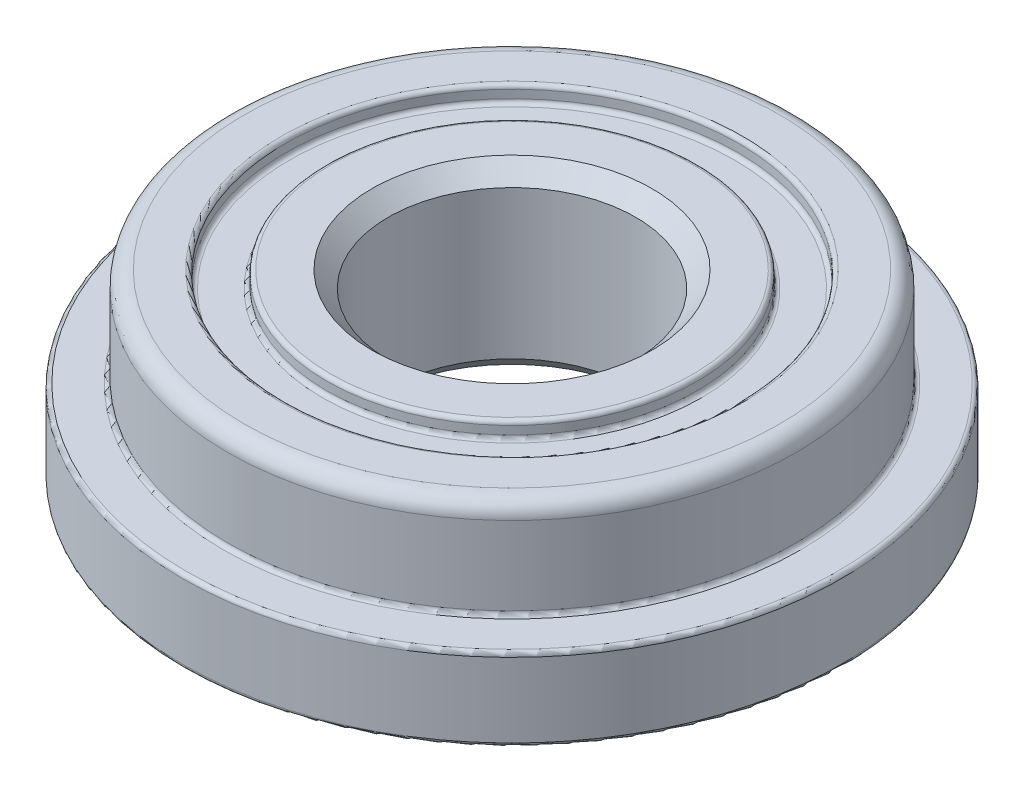
ISO-10303-21;
HEADER;
FILE_DESCRIPTION(('STEP AP214'),'2;1');
FILE_NAME('part.step','',(''),(''),'','','');
FILE_SCHEMA(('AUTOMOTIVE_DESIGN { 1 0 10303 214 1 1 1 1 }'));
ENDSEC;
DATA;
#1=APPLICATION_CONTEXT('core data for automotive mechanical design processes');
#2=APPLICATION_PROTOCOL_DEFINITION('international standard','automotive_design',2000,#1);
#3=PRODUCT_CONTEXT('',#1,'mechanical');
#4=PRODUCT('Part','Part','',(#3));
#5=PRODUCT_RELATED_PRODUCT_CATEGORY('part','',(#4));
#6=PRODUCT_DEFINITION_FORMATION('','',#4);
#7=PRODUCT_DEFINITION_CONTEXT('part definition',#1,'design');
#8=PRODUCT_DEFINITION('design','',#6,#7);
#9=PRODUCT_DEFINITION_SHAPE('','',#8);
#10=(LENGTH_UNIT() NAMED_UNIT(*) SI_UNIT(.MILLI.,.METRE.));
#11=(NAMED_UNIT(*) PLANE_ANGLE_UNIT() SI_UNIT($,.RADIAN.));
#12=(NAMED_UNIT(*) SI_UNIT($,.STERADIAN.) SOLID_ANGLE_UNIT());
#13=UNCERTAINTY_MEASURE_WITH_UNIT(LENGTH_MEASURE(1.E-05),#10,'distance_accuracy_value','');
#14=(GEOMETRIC_REPRESENTATION_CONTEXT(3) GLOBAL_UNCERTAINTY_ASSIGNED_CONTEXT((#13)) GLOBAL_UNIT_ASSIGNED_CONTEXT((#10,
#11,#12)) REPRESENTATION_CONTEXT('',''));
#15=CARTESIAN_POINT('',(0.,0.,0.));
#16=DIRECTION('',(0.,0.,1.));
#17=DIRECTION('',(1.,0.,0.));
#18=AXIS2_PLACEMENT_3D('',#15,#16,#17);
#19=CARTESIAN_POINT('',(0.,2.2,0.));
#20=DIRECTION('',(0.,1.,0.));
#21=DIRECTION('',(0.,0.,1.));
#22=AXIS2_PLACEMENT_3D('',#19,#20,#21);
#23=PLANE('',#22);
#24=CARTESIAN_POINT('',(0.,2.2,0.));
#25=DIRECTION('',(0.,1.,0.));
#26=DIRECTION('',(0.,0.,1.));
#27=AXIS2_PLACEMENT_3D('',#24,#25,#26);
#28=CIRCLE('',#27,2.2);
#29=CARTESIAN_POINT('',(0.,2.2,2.2));
#30=VERTEX_POINT('',#29);
#31=EDGE_CURVE('E84',#30,#30,#28,.T.);
#32=ORIENTED_EDGE('',*,*,#31,.T.);
#33=EDGE_LOOP('',(#32));
#34=FACE_BOUND('',#33,.T.);
#35=CARTESIAN_POINT('',(0.,2.2,0.));
#36=DIRECTION('',(0.,1.,0.));
#37=DIRECTION('',(0.,0.,1.));
#38=AXIS2_PLACEMENT_3D('',#35,#36,#37);
#39=CIRCLE('',#38,1.7);
#40=CARTESIAN_POINT('',(0.,2.2,1.7));
#41=VERTEX_POINT('',#40);
#42=EDGE_CURVE('E90',#41,#41,#39,.F.);
#43=ORIENTED_EDGE('',*,*,#42,.T.);
#44=EDGE_LOOP('',(#43));
#45=FACE_BOUND('',#44,.T.);
#46=ADVANCED_FACE('F37',(#34,#45),#23,.T.);
#47=CARTESIAN_POINT('',(0.,1.,0.));
#48=DIRECTION('',(0.,1.,0.));
#49=DIRECTION('',(0.,0.,1.));
#50=AXIS2_PLACEMENT_3D('',#47,#48,#49);
#51=PLANE('',#50);
#52=CARTESIAN_POINT('',(0.,1.,0.));
#53=DIRECTION('',(0.,1.,0.));
#54=DIRECTION('',(0.,0.,1.));
#55=AXIS2_PLACEMENT_3D('',#52,#53,#54);
#56=CIRCLE('',#55,3.95);
#57=CARTESIAN_POINT('',(0.,1.,3.95));
#58=VERTEX_POINT('',#57);
#59=EDGE_CURVE('E57',#58,#58,#56,.T.);
#60=ORIENTED_EDGE('',*,*,#59,.T.);
#61=EDGE_LOOP('',(#60));
#62=FACE_BOUND('',#61,.T.);
#63=CARTESIAN_POINT('',(0.,1.,0.));
#64=DIRECTION('',(0.,1.,0.));
#65=DIRECTION('',(0.,0.,1.));
#66=AXIS2_PLACEMENT_3D('',#63,#64,#65);
#67=CIRCLE('',#66,3.5);
#68=CARTESIAN_POINT('',(0.,1.,3.5));
#69=VERTEX_POINT('',#68);
#70=EDGE_CURVE('E60',#69,#69,#67,.F.);
#71=ORIENTED_EDGE('',*,*,#70,.T.);
#72=EDGE_LOOP('',(#71));
#73=FACE_BOUND('',#72,.T.);
#74=ADVANCED_FACE('F127',(#62,#73),#51,.T.);
#75=CARTESIAN_POINT('',(0.,1.,0.));
#76=DIRECTION('',(0.,-1.,0.));
#77=DIRECTION('',(0.,0.,-1.));
#78=AXIS2_PLACEMENT_3D('',#75,#76,#77);
#79=CYLINDRICAL_SURFACE('',#78,4.);
#80=CARTESIAN_POINT('',(0.,0.95,0.));
#81=DIRECTION('',(0.,1.,0.));
#82=DIRECTION('',(0.,0.,1.));
#83=AXIS2_PLACEMENT_3D('',#80,#81,#82);
#84=CIRCLE('',#83,4.);
#85=CARTESIAN_POINT('',(0.,0.95,4.));
#86=VERTEX_POINT('',#85);
#87=EDGE_CURVE('E48',#86,#86,#84,.F.);
#88=ORIENTED_EDGE('',*,*,#87,.T.);
#89=EDGE_LOOP('',(#88));
#90=FACE_BOUND('',#89,.T.);
#91=CARTESIAN_POINT('',(0.,0.05,0.));
#92=DIRECTION('',(0.,1.,0.));
#93=DIRECTION('',(0.,0.,1.));
#94=AXIS2_PLACEMENT_3D('',#91,#92,#93);
#95=CIRCLE('',#94,4.);
#96=CARTESIAN_POINT('',(0.,0.05,4.));
#97=VERTEX_POINT('',#96);
#98=EDGE_CURVE('E52',#97,#97,#95,.T.);
#99=ORIENTED_EDGE('',*,*,#98,.T.);
#100=EDGE_LOOP('',(#99));
#101=FACE_BOUND('',#100,.T.);
#102=ADVANCED_FACE('F132',(#90,#101),#79,.T.);
#103=CARTESIAN_POINT('',(0.,0.,0.));
#104=DIRECTION('',(0.,1.,0.));
#105=DIRECTION('',(0.,0.,1.));
#106=AXIS2_PLACEMENT_3D('',#103,#104,#105);
#107=PLANE('',#106);
#108=CARTESIAN_POINT('',(0.,0.,0.));
#109=DIRECTION('',(0.,1.,0.));
#110=DIRECTION('',(0.,0.,1.));
#111=AXIS2_PLACEMENT_3D('',#108,#109,#110);
#112=CIRCLE('',#111,3.95);
#113=CARTESIAN_POINT('',(0.,0.,3.95));
#114=VERTEX_POINT('',#113);
#115=EDGE_CURVE('E10',#114,#114,#112,.F.);
#116=ORIENTED_EDGE('',*,*,#115,.T.);
#117=EDGE_LOOP('',(#116));
#118=FACE_BOUND('',#117,.T.);
#119=CARTESIAN_POINT('',(0.,0.,0.));
#120=DIRECTION('',(0.,1.,0.));
#121=DIRECTION('',(0.,0.,1.));
#122=AXIS2_PLACEMENT_3D('',#119,#120,#121);
#123=CIRCLE('',#122,1.7);
#124=CARTESIAN_POINT('',(0.,0.,1.7));
#125=VERTEX_POINT('',#124);
#126=EDGE_CURVE('E87',#125,#125,#123,.T.);
#127=ORIENTED_EDGE('',*,*,#126,.T.);
#128=EDGE_LOOP('',(#127));
#129=FACE_BOUND('',#128,.T.);
#130=ADVANCED_FACE('F139',(#118,#129),#107,.F.);
#131=CARTESIAN_POINT('',(0.,2.2,0.));
#132=DIRECTION('',(0.,-1.,0.));
#133=DIRECTION('',(0.,0.,-1.));
#134=AXIS2_PLACEMENT_3D('',#131,#132,#133);
#135=CYLINDRICAL_SURFACE('',#134,3.45);
#136=CARTESIAN_POINT('',(0.,1.05,0.));
#137=DIRECTION('',(0.,1.,0.));
#138=DIRECTION('',(0.,0.,1.));
#139=AXIS2_PLACEMENT_3D('',#136,#137,#138);
#140=CIRCLE('',#139,3.45);
#141=CARTESIAN_POINT('',(0.,1.05,3.45));
#142=VERTEX_POINT('',#141);
#143=EDGE_CURVE('E44',#142,#142,#140,.T.);
#144=ORIENTED_EDGE('',*,*,#143,.T.);
#145=EDGE_LOOP('',(#144));
#146=FACE_BOUND('',#145,.T.);
#147=CARTESIAN_POINT('',(0.,2.,0.));
#148=DIRECTION('',(0.,1.,0.));
#149=DIRECTION('',(0.,0.,1.));
#150=AXIS2_PLACEMENT_3D('',#147,#148,#149);
#151=CIRCLE('',#150,3.45);
#152=CARTESIAN_POINT('',(0.,2.,3.45));
#153=VERTEX_POINT('',#152);
#154=EDGE_CURVE('E99',#153,#153,#151,.F.);
#155=ORIENTED_EDGE('',*,*,#154,.T.);
#156=EDGE_LOOP('',(#155));
#157=FACE_BOUND('',#156,.T.);
#158=ADVANCED_FACE('F120',(#146,#157),#135,.T.);
#159=CARTESIAN_POINT('',(0.,2.2,0.));
#160=DIRECTION('',(0.,1.,0.));
#161=DIRECTION('',(0.,0.,1.));
#162=AXIS2_PLACEMENT_3D('',#159,#160,#161);
#163=CIRCLE('',#162,2.8);
#164=CARTESIAN_POINT('',(0.,2.2,2.8));
#165=VERTEX_POINT('',#164);
#166=EDGE_CURVE('E63',#165,#165,#163,.F.);
#167=ORIENTED_EDGE('',*,*,#166,.T.);
#168=EDGE_LOOP('',(#167));
#169=FACE_BOUND('',#168,.T.);
#170=CARTESIAN_POINT('',(0.,2.2,0.));
#171=DIRECTION('',(0.,1.,0.));
#172=DIRECTION('',(0.,0.,1.));
#173=AXIS2_PLACEMENT_3D('',#170,#171,#172);
#174=CIRCLE('',#173,3.25);
#175=CARTESIAN_POINT('',(0.,2.2,3.25));
#176=VERTEX_POINT('',#175);
#177=EDGE_CURVE('E102',#176,#176,#174,.T.);
#178=ORIENTED_EDGE('',*,*,#177,.T.);
#179=EDGE_LOOP('',(#178));
#180=FACE_BOUND('',#179,.T.);
#181=ADVANCED_FACE('F106',(#169,#180),#23,.T.);
#182=CARTESIAN_POINT('',(0.,2.,0.));
#183=DIRECTION('',(0.,1.,0.));
#184=DIRECTION('',(0.,0.,1.));
#185=AXIS2_PLACEMENT_3D('',#182,#183,#184);
#186=TOROIDAL_SURFACE('',#185,3.25,0.2);
#187=ORIENTED_EDGE('',*,*,#154,.F.);
#188=EDGE_LOOP('',(#187));
#189=FACE_BOUND('',#188,.T.);
#190=ORIENTED_EDGE('',*,*,#177,.F.);
#191=EDGE_LOOP('',(#190));
#192=FACE_BOUND('',#191,.T.);
#193=ADVANCED_FACE('F108',(#189,#192),#186,.T.);
#194=CARTESIAN_POINT('',(0.,0.,0.));
#195=DIRECTION('',(0.,1.,0.));
#196=DIRECTION('',(0.,0.,1.));
#197=AXIS2_PLACEMENT_3D('',#194,#195,#196);
#198=CYLINDRICAL_SURFACE('',#197,1.5);
#199=CARTESIAN_POINT('',(0.,2.,0.));
#200=DIRECTION('',(0.,1.,0.));
#201=DIRECTION('',(0.,0.,1.));
#202=AXIS2_PLACEMENT_3D('',#199,#200,#201);
#203=CIRCLE('',#202,1.5);
#204=CARTESIAN_POINT('',(0.,2.,1.5));
#205=VERTEX_POINT('',#204);
#206=EDGE_CURVE('E93',#205,#205,#203,.T.);
#207=ORIENTED_EDGE('',*,*,#206,.T.);
#208=EDGE_LOOP('',(#207));
#209=FACE_BOUND('',#208,.T.);
#210=CARTESIAN_POINT('',(0.,0.200000000000002,0.));
#211=DIRECTION('',(0.,1.,0.));
#212=DIRECTION('',(0.,0.,1.));
#213=AXIS2_PLACEMENT_3D('',#210,#211,#212);
#214=CIRCLE('',#213,1.5);
#215=CARTESIAN_POINT('',(0.,0.200000000000002,1.5));
#216=VERTEX_POINT('',#215);
#217=EDGE_CURVE('E96',#216,#216,#214,.F.);
#218=ORIENTED_EDGE('',*,*,#217,.T.);
#219=EDGE_LOOP('',(#218));
#220=FACE_BOUND('',#219,.T.);
#221=ADVANCED_FACE('F110',(#209,#220),#198,.F.);
#222=CARTESIAN_POINT('',(0.,2.,0.));
#223=DIRECTION('',(0.,1.,0.));
#224=DIRECTION('',(0.,0.,1.));
#225=AXIS2_PLACEMENT_3D('',#222,#223,#224);
#226=CONICAL_SURFACE('',#225,1.5,0.785398163397449);
#227=ORIENTED_EDGE('',*,*,#42,.F.);
#228=EDGE_LOOP('',(#227));
#229=FACE_BOUND('',#228,.T.);
#230=ORIENTED_EDGE('',*,*,#206,.F.);
#231=EDGE_LOOP('',(#230));
#232=FACE_BOUND('',#231,.T.);
#233=ADVANCED_FACE('F117',(#229,#232),#226,.F.);
#234=CARTESIAN_POINT('',(0.,0.,0.));
#235=DIRECTION('',(0.,-1.,0.));
#236=DIRECTION('',(0.,0.,-1.));
#237=AXIS2_PLACEMENT_3D('',#234,#235,#236);
#238=CONICAL_SURFACE('',#237,1.7,0.785398163397448);
#239=ORIENTED_EDGE('',*,*,#217,.F.);
#240=EDGE_LOOP('',(#239));
#241=FACE_BOUND('',#240,.T.);
#242=ORIENTED_EDGE('',*,*,#126,.F.);
#243=EDGE_LOOP('',(#242));
#244=FACE_BOUND('',#243,.T.);
#245=ADVANCED_FACE('F183',(#241,#244),#238,.F.);
#246=CARTESIAN_POINT('',(0.,2.,0.));
#247=DIRECTION('',(0.,1.,0.));
#248=DIRECTION('',(0.,0.,1.));
#249=AXIS2_PLACEMENT_3D('',#246,#247,#248);
#250=CYLINDRICAL_SURFACE('',#249,2.75);
#251=CARTESIAN_POINT('',(0.,2.15,0.));
#252=DIRECTION('',(0.,1.,0.));
#253=DIRECTION('',(0.,0.,1.));
#254=AXIS2_PLACEMENT_3D('',#251,#252,#253);
#255=CIRCLE('',#254,2.75);
#256=CARTESIAN_POINT('',(0.,2.15,2.75));
#257=VERTEX_POINT('',#256);
#258=EDGE_CURVE('E66',#257,#257,#255,.T.);
#259=ORIENTED_EDGE('',*,*,#258,.T.);
#260=EDGE_LOOP('',(#259));
#261=FACE_BOUND('',#260,.T.);
#262=CARTESIAN_POINT('',(0.,2.05,0.));
#263=DIRECTION('',(0.,1.,0.));
#264=DIRECTION('',(0.,0.,1.));
#265=AXIS2_PLACEMENT_3D('',#262,#263,#264);
#266=CIRCLE('',#265,2.75);
#267=CARTESIAN_POINT('',(0.,2.05,2.75));
#268=VERTEX_POINT('',#267);
#269=EDGE_CURVE('E69',#268,#268,#266,.F.);
#270=ORIENTED_EDGE('',*,*,#269,.T.);
#271=EDGE_LOOP('',(#270));
#272=FACE_BOUND('',#271,.T.);
#273=ADVANCED_FACE('F185',(#261,#272),#250,.F.);
#274=CARTESIAN_POINT('',(0.,2.,0.));
#275=DIRECTION('',(0.,1.,0.));
#276=DIRECTION('',(0.,0.,1.));
#277=AXIS2_PLACEMENT_3D('',#274,#275,#276);
#278=PLANE('',#277);
#279=CARTESIAN_POINT('',(0.,2.,0.));
#280=DIRECTION('',(0.,1.,0.));
#281=DIRECTION('',(0.,0.,1.));
#282=AXIS2_PLACEMENT_3D('',#279,#280,#281);
#283=CIRCLE('',#282,2.3);
#284=CARTESIAN_POINT('',(0.,2.,2.3));
#285=VERTEX_POINT('',#284);
#286=EDGE_CURVE('E72',#285,#285,#283,.F.);
#287=ORIENTED_EDGE('',*,*,#286,.T.);
#288=EDGE_LOOP('',(#287));
#289=FACE_BOUND('',#288,.T.);
#290=CARTESIAN_POINT('',(0.,2.,0.));
#291=DIRECTION('',(0.,1.,0.));
#292=DIRECTION('',(0.,0.,1.));
#293=AXIS2_PLACEMENT_3D('',#290,#291,#292);
#294=CIRCLE('',#293,2.7);
#295=CARTESIAN_POINT('',(0.,2.,2.7));
#296=VERTEX_POINT('',#295);
#297=EDGE_CURVE('E75',#296,#296,#294,.T.);
#298=ORIENTED_EDGE('',*,*,#297,.T.);
#299=EDGE_LOOP('',(#298));
#300=FACE_BOUND('',#299,.T.);
#301=ADVANCED_FACE('F211',(#289,#300),#278,.T.);
#302=CARTESIAN_POINT('',(0.,2.,0.));
#303=DIRECTION('',(0.,1.,0.));
#304=DIRECTION('',(0.,0.,1.));
#305=AXIS2_PLACEMENT_3D('',#302,#303,#304);
#306=CYLINDRICAL_SURFACE('',#305,2.25);
#307=CARTESIAN_POINT('',(0.,2.15,0.));
#308=DIRECTION('',(0.,1.,0.));
#309=DIRECTION('',(0.,0.,1.));
#310=AXIS2_PLACEMENT_3D('',#307,#308,#309);
#311=CIRCLE('',#310,2.25);
#312=CARTESIAN_POINT('',(0.,2.15,2.25));
#313=VERTEX_POINT('',#312);
#314=EDGE_CURVE('E78',#313,#313,#311,.F.);
#315=ORIENTED_EDGE('',*,*,#314,.T.);
#316=EDGE_LOOP('',(#315));
#317=FACE_BOUND('',#316,.T.);
#318=CARTESIAN_POINT('',(0.,2.05,0.));
#319=DIRECTION('',(0.,1.,0.));
#320=DIRECTION('',(0.,0.,1.));
#321=AXIS2_PLACEMENT_3D('',#318,#319,#320);
#322=CIRCLE('',#321,2.25);
#323=CARTESIAN_POINT('',(0.,2.05,2.25));
#324=VERTEX_POINT('',#323);
#325=EDGE_CURVE('E81',#324,#324,#322,.T.);
#326=ORIENTED_EDGE('',*,*,#325,.T.);
#327=EDGE_LOOP('',(#326));
#328=FACE_BOUND('',#327,.T.);
#329=ADVANCED_FACE('F181',(#317,#328),#306,.T.);
#330=CARTESIAN_POINT('',(0.,2.15,0.));
#331=DIRECTION('',(0.,1.,0.));
#332=DIRECTION('',(0.,0.,1.));
#333=AXIS2_PLACEMENT_3D('',#330,#331,#332);
#334=TOROIDAL_SURFACE('',#333,2.2,0.05);
#335=ORIENTED_EDGE('',*,*,#314,.F.);
#336=EDGE_LOOP('',(#335));
#337=FACE_BOUND('',#336,.T.);
#338=ORIENTED_EDGE('',*,*,#31,.F.);
#339=EDGE_LOOP('',(#338));
#340=FACE_BOUND('',#339,.T.);
#341=ADVANCED_FACE('F177',(#337,#340),#334,.T.);
#342=CARTESIAN_POINT('',(0.,2.05,0.));
#343=DIRECTION('',(0.,1.,0.));
#344=DIRECTION('',(0.,0.,1.));
#345=AXIS2_PLACEMENT_3D('',#342,#343,#344);
#346=TOROIDAL_SURFACE('',#345,2.3,0.05);
#347=ORIENTED_EDGE('',*,*,#286,.F.);
#348=EDGE_LOOP('',(#347));
#349=FACE_BOUND('',#348,.T.);
#350=ORIENTED_EDGE('',*,*,#325,.F.);
#351=EDGE_LOOP('',(#350));
#352=FACE_BOUND('',#351,.T.);
#353=ADVANCED_FACE('F173',(#349,#352),#346,.F.);
#354=CARTESIAN_POINT('',(0.,2.15,0.));
#355=DIRECTION('',(0.,1.,0.));
#356=DIRECTION('',(0.,0.,1.));
#357=AXIS2_PLACEMENT_3D('',#354,#355,#356);
#358=TOROIDAL_SURFACE('',#357,2.8,0.05);
#359=ORIENTED_EDGE('',*,*,#166,.F.);
#360=EDGE_LOOP('',(#359));
#361=FACE_BOUND('',#360,.T.);
#362=ORIENTED_EDGE('',*,*,#258,.F.);
#363=EDGE_LOOP('',(#362));
#364=FACE_BOUND('',#363,.T.);
#365=ADVANCED_FACE('F169',(#361,#364),#358,.T.);
#366=CARTESIAN_POINT('',(0.,2.05,0.));
#367=DIRECTION('',(0.,1.,0.));
#368=DIRECTION('',(0.,0.,1.));
#369=AXIS2_PLACEMENT_3D('',#366,#367,#368);
#370=TOROIDAL_SURFACE('',#369,2.7,0.05);
#371=ORIENTED_EDGE('',*,*,#269,.F.);
#372=EDGE_LOOP('',(#371));
#373=FACE_BOUND('',#372,.T.);
#374=ORIENTED_EDGE('',*,*,#297,.F.);
#375=EDGE_LOOP('',(#374));
#376=FACE_BOUND('',#375,.T.);
#377=ADVANCED_FACE('F161',(#373,#376),#370,.F.);
#378=CARTESIAN_POINT('',(0.,0.95,0.));
#379=DIRECTION('',(0.,1.,0.));
#380=DIRECTION('',(0.,0.,1.));
#381=AXIS2_PLACEMENT_3D('',#378,#379,#380);
#382=TOROIDAL_SURFACE('',#381,3.95,0.05);
#383=ORIENTED_EDGE('',*,*,#87,.F.);
#384=EDGE_LOOP('',(#383));
#385=FACE_BOUND('',#384,.T.);
#386=ORIENTED_EDGE('',*,*,#59,.F.);
#387=EDGE_LOOP('',(#386));
#388=FACE_BOUND('',#387,.T.);
#389=ADVANCED_FACE('F156',(#385,#388),#382,.T.);
#390=CARTESIAN_POINT('',(0.,1.05,0.));
#391=DIRECTION('',(0.,1.,0.));
#392=DIRECTION('',(0.,0.,1.));
#393=AXIS2_PLACEMENT_3D('',#390,#391,#392);
#394=TOROIDAL_SURFACE('',#393,3.5,0.05);
#395=ORIENTED_EDGE('',*,*,#70,.F.);
#396=EDGE_LOOP('',(#395));
#397=FACE_BOUND('',#396,.T.);
#398=ORIENTED_EDGE('',*,*,#143,.F.);
#399=EDGE_LOOP('',(#398));
#400=FACE_BOUND('',#399,.T.);
#401=ADVANCED_FACE('F151',(#397,#400),#394,.F.);
#402=CARTESIAN_POINT('',(0.,0.05,0.));
#403=DIRECTION('',(0.,1.,0.));
#404=DIRECTION('',(0.,0.,1.));
#405=AXIS2_PLACEMENT_3D('',#402,#403,#404);
#406=TOROIDAL_SURFACE('',#405,3.95,0.05);
#407=ORIENTED_EDGE('',*,*,#115,.F.);
#408=EDGE_LOOP('',(#407));
#409=FACE_BOUND('',#408,.T.);
#410=ORIENTED_EDGE('',*,*,#98,.F.);
#411=EDGE_LOOP('',(#410));
#412=FACE_BOUND('',#411,.T.);
#413=ADVANCED_FACE('F39',(#409,#412),#406,.T.);
#414=CLOSED_SHELL('',(#46,#74,#102,#130,#158,#181,#193,#221,#233,#245,#273,#301,#329,#341,#353,
#365,#377,#389,#401,#413));
#415=MANIFOLD_SOLID_BREP('B2',#414);
#416=ADVANCED_BREP_SHAPE_REPRESENTATION('',(#18,#415),#14);
#417=SHAPE_DEFINITION_REPRESENTATION(#9,#416);
ENDSEC;
END-ISO-10303-21;
